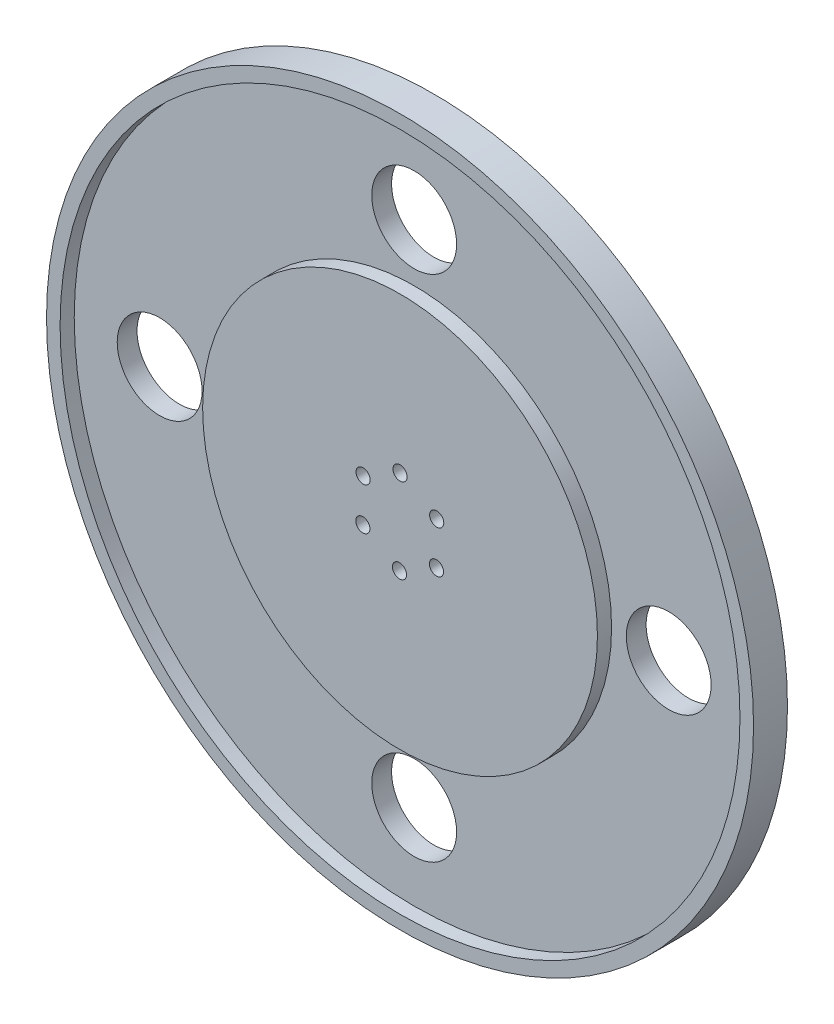
ISO-10303-21;
HEADER;
FILE_DESCRIPTION(('STEP AP214'),'2;1');
FILE_NAME('part.step','',(''),(''),'','','');
FILE_SCHEMA(('AUTOMOTIVE_DESIGN { 1 0 10303 214 1 1 1 1 }'));
ENDSEC;
DATA;
#1=APPLICATION_CONTEXT('core data for automotive mechanical design processes');
#2=APPLICATION_PROTOCOL_DEFINITION('international standard','automotive_design',2000,#1);
#3=PRODUCT_CONTEXT('',#1,'mechanical');
#4=PRODUCT('Part','Part','',(#3));
#5=PRODUCT_RELATED_PRODUCT_CATEGORY('part','',(#4));
#6=PRODUCT_DEFINITION_FORMATION('','',#4);
#7=PRODUCT_DEFINITION_CONTEXT('part definition',#1,'design');
#8=PRODUCT_DEFINITION('design','',#6,#7);
#9=PRODUCT_DEFINITION_SHAPE('','',#8);
#10=(LENGTH_UNIT() NAMED_UNIT(*) SI_UNIT(.MILLI.,.METRE.));
#11=(NAMED_UNIT(*) PLANE_ANGLE_UNIT() SI_UNIT($,.RADIAN.));
#12=(NAMED_UNIT(*) SI_UNIT($,.STERADIAN.) SOLID_ANGLE_UNIT());
#13=UNCERTAINTY_MEASURE_WITH_UNIT(LENGTH_MEASURE(1.E-05),#10,'distance_accuracy_value','');
#14=(GEOMETRIC_REPRESENTATION_CONTEXT(3) GLOBAL_UNCERTAINTY_ASSIGNED_CONTEXT((#13)) GLOBAL_UNIT_ASSIGNED_CONTEXT((#10,
#11,#12)) REPRESENTATION_CONTEXT('',''));
#15=CARTESIAN_POINT('',(0.,0.,0.));
#16=DIRECTION('',(0.,0.,1.));
#17=DIRECTION('',(1.,0.,0.));
#18=AXIS2_PLACEMENT_3D('',#15,#16,#17);
#19=CARTESIAN_POINT('',(0.,0.,7.62));
#20=DIRECTION('',(0.,0.,-1.));
#21=DIRECTION('',(-1.,0.,0.));
#22=AXIS2_PLACEMENT_3D('',#19,#20,#21);
#23=CYLINDRICAL_SURFACE('',#22,44.323);
#24=CARTESIAN_POINT('',(0.,0.,4.445));
#25=DIRECTION('',(0.,0.,1.));
#26=DIRECTION('',(1.,0.,0.));
#27=AXIS2_PLACEMENT_3D('',#24,#25,#26);
#28=CIRCLE('',#27,44.323);
#29=CARTESIAN_POINT('',(-44.323,0.,4.445));
#30=VERTEX_POINT('',#29);
#31=EDGE_CURVE('E47',#30,#30,#28,.T.);
#32=CARTESIAN_POINT('',(0.,0.,7.62));
#33=DIRECTION('',(0.,0.,1.));
#34=DIRECTION('',(1.,0.,0.));
#35=AXIS2_PLACEMENT_3D('',#32,#33,#34);
#36=CIRCLE('',#35,44.323);
#37=CARTESIAN_POINT('',(-44.323,0.,7.62));
#38=VERTEX_POINT('',#37);
#39=EDGE_CURVE('E11',#38,#38,#36,.T.);
#40=CARTESIAN_POINT('',(-44.323,0.,4.445));
#41=CARTESIAN_POINT('',(-44.323,0.,4.47807291666667));
#42=CARTESIAN_POINT('',(-44.323,0.,4.51114583333333));
#43=CARTESIAN_POINT('',(-44.323,0.,4.57729166666667));
#44=CARTESIAN_POINT('',(-44.323,0.,4.61036458333333));
#45=CARTESIAN_POINT('',(-44.323,0.,4.67651041666667));
#46=CARTESIAN_POINT('',(-44.323,0.,4.70958333333333));
#47=CARTESIAN_POINT('',(-44.323,0.,4.77572916666667));
#48=CARTESIAN_POINT('',(-44.323,0.,4.80880208333333));
#49=CARTESIAN_POINT('',(-44.323,0.,4.87494791666667));
#50=CARTESIAN_POINT('',(-44.323,0.,4.90802083333333));
#51=CARTESIAN_POINT('',(-44.323,0.,4.97416666666667));
#52=CARTESIAN_POINT('',(-44.323,0.,5.00723958333333));
#53=CARTESIAN_POINT('',(-44.323,0.,5.07338541666667));
#54=CARTESIAN_POINT('',(-44.323,0.,5.10645833333333));
#55=CARTESIAN_POINT('',(-44.323,0.,5.17260416666667));
#56=CARTESIAN_POINT('',(-44.323,0.,5.20567708333333));
#57=CARTESIAN_POINT('',(-44.323,0.,5.27182291666667));
#58=CARTESIAN_POINT('',(-44.323,0.,5.30489583333333));
#59=CARTESIAN_POINT('',(-44.323,0.,5.37104166666667));
#60=CARTESIAN_POINT('',(-44.323,0.,5.40411458333333));
#61=CARTESIAN_POINT('',(-44.323,0.,5.47026041666667));
#62=CARTESIAN_POINT('',(-44.323,0.,5.50333333333333));
#63=CARTESIAN_POINT('',(-44.323,0.,5.56947916666667));
#64=CARTESIAN_POINT('',(-44.323,0.,5.60255208333333));
#65=CARTESIAN_POINT('',(-44.323,0.,5.66869791666667));
#66=CARTESIAN_POINT('',(-44.323,0.,5.70177083333333));
#67=CARTESIAN_POINT('',(-44.323,0.,5.76791666666667));
#68=CARTESIAN_POINT('',(-44.323,0.,5.80098958333333));
#69=CARTESIAN_POINT('',(-44.323,0.,5.86713541666667));
#70=CARTESIAN_POINT('',(-44.323,0.,5.90020833333333));
#71=CARTESIAN_POINT('',(-44.323,0.,5.96635416666667));
#72=CARTESIAN_POINT('',(-44.323,0.,5.99942708333333));
#73=CARTESIAN_POINT('',(-44.323,0.,6.06557291666667));
#74=CARTESIAN_POINT('',(-44.323,0.,6.09864583333333));
#75=CARTESIAN_POINT('',(-44.323,0.,6.16479166666667));
#76=CARTESIAN_POINT('',(-44.323,0.,6.19786458333333));
#77=CARTESIAN_POINT('',(-44.323,0.,6.26401041666667));
#78=CARTESIAN_POINT('',(-44.323,0.,6.29708333333333));
#79=CARTESIAN_POINT('',(-44.323,0.,6.36322916666667));
#80=CARTESIAN_POINT('',(-44.323,0.,6.39630208333333));
#81=CARTESIAN_POINT('',(-44.323,0.,6.46244791666667));
#82=CARTESIAN_POINT('',(-44.323,0.,6.49552083333333));
#83=CARTESIAN_POINT('',(-44.323,0.,6.56166666666667));
#84=CARTESIAN_POINT('',(-44.323,0.,6.59473958333333));
#85=CARTESIAN_POINT('',(-44.323,0.,6.66088541666667));
#86=CARTESIAN_POINT('',(-44.323,0.,6.69395833333333));
#87=CARTESIAN_POINT('',(-44.323,0.,6.76010416666667));
#88=CARTESIAN_POINT('',(-44.323,0.,6.79317708333333));
#89=CARTESIAN_POINT('',(-44.323,0.,6.85932291666667));
#90=CARTESIAN_POINT('',(-44.323,0.,6.89239583333333));
#91=CARTESIAN_POINT('',(-44.323,0.,6.95854166666667));
#92=CARTESIAN_POINT('',(-44.323,0.,6.99161458333333));
#93=CARTESIAN_POINT('',(-44.323,0.,7.05776041666667));
#94=CARTESIAN_POINT('',(-44.323,0.,7.09083333333333));
#95=CARTESIAN_POINT('',(-44.323,0.,7.15697916666667));
#96=CARTESIAN_POINT('',(-44.323,0.,7.19005208333333));
#97=CARTESIAN_POINT('',(-44.323,0.,7.25619791666667));
#98=CARTESIAN_POINT('',(-44.323,0.,7.28927083333333));
#99=CARTESIAN_POINT('',(-44.323,0.,7.35541666666667));
#100=CARTESIAN_POINT('',(-44.323,0.,7.38848958333333));
#101=CARTESIAN_POINT('',(-44.323,0.,7.45463541666667));
#102=CARTESIAN_POINT('',(-44.323,0.,7.48770833333333));
#103=CARTESIAN_POINT('',(-44.323,0.,7.55385416666667));
#104=CARTESIAN_POINT('',(-44.323,0.,7.58692708333333));
#105=CARTESIAN_POINT('',(-44.323,0.,7.62));
#106=B_SPLINE_CURVE_WITH_KNOTS('',3,(#40,#41,#42,#43,#44,#45,#46,#47,#48,#49,#50,#51,#52,#53,
#54,#55,#56,#57,#58,#59,#60,#61,#62,#63,#64,#65,#66,#67,#68,#69,#70,#71,#72,#73,#74,#75,#76,#77,
#78,#79,#80,#81,#82,#83,#84,#85,#86,#87,#88,#89,#90,#91,#92,#93,#94,#95,#96,#97,#98,#99,#100,
#101,#102,#103,#104,#105),.UNSPECIFIED.,.F.,.F.,(4,2,2,2,2,2,2,2,2,2,2,2,2,2,2,2,2,2,2,2,2,2,2,
2,2,2,2,2,2,2,2,2,4),(0.,0.0992187499999995,0.198437499999999,0.29765625,0.396875,
0.496093749999999,0.595312499999999,0.69453125,0.793749999999999,0.89296875,0.9921875,
1.09140625,1.190625,1.28984375,1.3890625,1.48828125,1.5875,1.68671875,1.7859375,1.88515625,
1.984375,2.08359375,2.1828125,2.28203125,2.38125,2.48046875,2.5796875,2.67890625,2.778125,
2.87734375,2.9765625,3.07578125,3.175),.UNSPECIFIED.);
#107=EDGE_CURVE('BSEAM41',#30,#38,#106,.T.);
#108=ORIENTED_EDGE('',*,*,#31,.T.);
#109=ORIENTED_EDGE('',*,*,#39,.F.);
#110=ORIENTED_EDGE('',*,*,#107,.T.);
#111=ORIENTED_EDGE('',*,*,#107,.F.);
#112=EDGE_LOOP('',(#108,#110,#109,#111));
#113=FACE_BOUND('',#112,.T.);
#114=ADVANCED_FACE('F41',(#113),#23,.T.);
#115=CARTESIAN_POINT('',(0.,0.,7.62));
#116=DIRECTION('',(0.,0.,1.));
#117=DIRECTION('',(1.,0.,0.));
#118=AXIS2_PLACEMENT_3D('',#115,#116,#117);
#119=PLANE('',#118);
#120=CARTESIAN_POINT('',(0.,9.4996,7.62));
#121=DIRECTION('',(0.,0.,1.));
#122=DIRECTION('',(1.,0.,0.));
#123=AXIS2_PLACEMENT_3D('',#120,#121,#122);
#124=CIRCLE('',#123,1.5875);
#125=CARTESIAN_POINT('',(1.5875,9.4996,7.62));
#126=VERTEX_POINT('',#125);
#127=EDGE_CURVE('E116',#126,#126,#124,.F.);
#128=ORIENTED_EDGE('',*,*,#127,.T.);
#129=EDGE_LOOP('',(#128));
#130=FACE_BOUND('',#129,.T.);
#131=CARTESIAN_POINT('',(8.23253142357247,4.6766934802765,7.62));
#132=DIRECTION('',(0.,0.,1.));
#133=DIRECTION('',(1.,0.,0.));
#134=AXIS2_PLACEMENT_3D('',#131,#132,#133);
#135=CIRCLE('',#134,1.5875);
#136=CARTESIAN_POINT('',(9.82003142357247,4.6766934802765,7.62));
#137=VERTEX_POINT('',#136);
#138=EDGE_CURVE('E117',#137,#137,#135,.F.);
#139=ORIENTED_EDGE('',*,*,#138,.T.);
#140=EDGE_LOOP('',(#139));
#141=FACE_BOUND('',#140,.T.);
#142=CARTESIAN_POINT('',(8.17203756920048,-4.86434112985266,7.62));
#143=DIRECTION('',(0.,0.,1.));
#144=DIRECTION('',(1.,0.,0.));
#145=AXIS2_PLACEMENT_3D('',#142,#143,#144);
#146=CIRCLE('',#145,1.5875);
#147=CARTESIAN_POINT('',(9.75953756920048,-4.86434112985266,7.62));
#148=VERTEX_POINT('',#147);
#149=EDGE_CURVE('E91',#148,#148,#146,.F.);
#150=ORIENTED_EDGE('',*,*,#149,.T.);
#151=EDGE_LOOP('',(#150));
#152=FACE_BOUND('',#151,.T.);
#153=CARTESIAN_POINT('',(-0.120987708743892,-9.5824692202583,7.62));
#154=DIRECTION('',(0.,0.,1.));
#155=DIRECTION('',(1.,0.,0.));
#156=AXIS2_PLACEMENT_3D('',#153,#154,#155);
#157=CIRCLE('',#156,1.5875);
#158=CARTESIAN_POINT('',(1.46651229125611,-9.5824692202583,7.62));
#159=VERTEX_POINT('',#158);
#160=EDGE_CURVE('E98',#159,#159,#157,.F.);
#161=ORIENTED_EDGE('',*,*,#160,.T.);
#162=EDGE_LOOP('',(#161));
#163=FACE_BOUND('',#162,.T.);
#164=CARTESIAN_POINT('',(-8.3535191323163,-4.75956270053477,7.62));
#165=DIRECTION('',(0.,0.,1.));
#166=DIRECTION('',(1.,0.,0.));
#167=AXIS2_PLACEMENT_3D('',#164,#165,#166);
#168=CIRCLE('',#167,1.5875);
#169=CARTESIAN_POINT('',(-6.76601913231631,-4.75956270053477,7.62));
#170=VERTEX_POINT('',#169);
#171=EDGE_CURVE('E104',#170,#170,#168,.F.);
#172=ORIENTED_EDGE('',*,*,#171,.T.);
#173=EDGE_LOOP('',(#172));
#174=FACE_BOUND('',#173,.T.);
#175=CARTESIAN_POINT('',(-8.29302527794436,4.78147190959437,7.62));
#176=DIRECTION('',(0.,0.,1.));
#177=DIRECTION('',(1.,0.,0.));
#178=AXIS2_PLACEMENT_3D('',#175,#176,#177);
#179=CIRCLE('',#178,1.5875);
#180=CARTESIAN_POINT('',(-6.70552527794437,4.78147190959437,7.62));
#181=VERTEX_POINT('',#180);
#182=EDGE_CURVE('E110',#181,#181,#179,.F.);
#183=ORIENTED_EDGE('',*,*,#182,.T.);
#184=EDGE_LOOP('',(#183));
#185=FACE_BOUND('',#184,.T.);
#186=ORIENTED_EDGE('',*,*,#39,.T.);
#187=EDGE_LOOP('',(#186));
#188=FACE_BOUND('',#187,.T.);
#189=ADVANCED_FACE('F170',(#130,#141,#152,#163,#174,#185,#188),#119,.T.);
#190=CARTESIAN_POINT('',(0.,0.,4.445));
#191=DIRECTION('',(0.,0.,1.));
#192=DIRECTION('',(1.,0.,0.));
#193=AXIS2_PLACEMENT_3D('',#190,#191,#192);
#194=PLANE('',#193);
#195=CARTESIAN_POINT('',(0.,57.15,4.445));
#196=DIRECTION('',(0.,0.,1.));
#197=DIRECTION('',(1.,0.,0.));
#198=AXIS2_PLACEMENT_3D('',#195,#196,#197);
#199=CIRCLE('',#198,9.525);
#200=CARTESIAN_POINT('',(9.525,57.15,4.445));
#201=VERTEX_POINT('',#200);
#202=EDGE_CURVE('E86',#201,#201,#199,.F.);
#203=ORIENTED_EDGE('',*,*,#202,.T.);
#204=EDGE_LOOP('',(#203));
#205=FACE_BOUND('',#204,.T.);
#206=CARTESIAN_POINT('',(57.1499999999984,-1.62430069394759E-12,4.445));
#207=DIRECTION('',(0.,0.,1.));
#208=DIRECTION('',(1.,0.,0.));
#209=AXIS2_PLACEMENT_3D('',#206,#207,#208);
#210=CIRCLE('',#209,9.525);
#211=CARTESIAN_POINT('',(66.6749999999984,-1.62430069394759E-12,4.445));
#212=VERTEX_POINT('',#211);
#213=EDGE_CURVE('E80',#212,#212,#210,.F.);
#214=ORIENTED_EDGE('',*,*,#213,.T.);
#215=EDGE_LOOP('',(#214));
#216=FACE_BOUND('',#215,.T.);
#217=CARTESIAN_POINT('',(-3.23460367498092E-12,-57.15,4.445));
#218=DIRECTION('',(0.,0.,1.));
#219=DIRECTION('',(1.,0.,0.));
#220=AXIS2_PLACEMENT_3D('',#217,#218,#219);
#221=CIRCLE('',#220,9.525);
#222=CARTESIAN_POINT('',(9.52499999999676,-57.15,4.445));
#223=VERTEX_POINT('',#222);
#224=EDGE_CURVE('E74',#223,#223,#221,.F.);
#225=ORIENTED_EDGE('',*,*,#224,.T.);
#226=EDGE_LOOP('',(#225));
#227=FACE_BOUND('',#226,.T.);
#228=CARTESIAN_POINT('',(-57.1500000000016,1.61730183749046E-12,4.445));
#229=DIRECTION('',(0.,0.,1.));
#230=DIRECTION('',(1.,0.,0.));
#231=AXIS2_PLACEMENT_3D('',#228,#229,#230);
#232=CIRCLE('',#231,9.525);
#233=CARTESIAN_POINT('',(-47.6250000000016,1.61730183749046E-12,4.445));
#234=VERTEX_POINT('',#233);
#235=EDGE_CURVE('E67',#234,#234,#232,.F.);
#236=ORIENTED_EDGE('',*,*,#235,.T.);
#237=EDGE_LOOP('',(#236));
#238=FACE_BOUND('',#237,.T.);
#239=ORIENTED_EDGE('',*,*,#31,.F.);
#240=EDGE_LOOP('',(#239));
#241=FACE_BOUND('',#240,.T.);
#242=CARTESIAN_POINT('',(0.,0.,4.445));
#243=DIRECTION('',(0.,0.,1.));
#244=DIRECTION('',(1.,0.,0.));
#245=AXIS2_PLACEMENT_3D('',#242,#243,#244);
#246=CIRCLE('',#245,76.327);
#247=CARTESIAN_POINT('',(-76.327,0.,4.445));
#248=VERTEX_POINT('',#247);
#249=EDGE_CURVE('E51',#248,#248,#246,.F.);
#250=ORIENTED_EDGE('',*,*,#249,.F.);
#251=EDGE_LOOP('',(#250));
#252=FACE_BOUND('',#251,.T.);
#253=ADVANCED_FACE('F165',(#205,#216,#227,#238,#241,#252),#194,.T.);
#254=CARTESIAN_POINT('',(0.,0.,7.62));
#255=DIRECTION('',(0.,0.,-1.));
#256=DIRECTION('',(-1.,0.,0.));
#257=AXIS2_PLACEMENT_3D('',#254,#255,#256);
#258=CYLINDRICAL_SURFACE('',#257,76.327);
#259=CARTESIAN_POINT('',(0.,0.,7.62));
#260=DIRECTION('',(0.,0.,1.));
#261=DIRECTION('',(1.,0.,0.));
#262=AXIS2_PLACEMENT_3D('',#259,#260,#261);
#263=CIRCLE('',#262,76.327);
#264=CARTESIAN_POINT('',(-76.327,0.,7.62));
#265=VERTEX_POINT('',#264);
#266=EDGE_CURVE('E61',#265,#265,#263,.T.);
#267=CARTESIAN_POINT('',(-76.327,0.,4.445));
#268=CARTESIAN_POINT('',(-76.327,0.,4.47807291666667));
#269=CARTESIAN_POINT('',(-76.327,0.,4.51114583333333));
#270=CARTESIAN_POINT('',(-76.327,0.,4.57729166666667));
#271=CARTESIAN_POINT('',(-76.327,0.,4.61036458333333));
#272=CARTESIAN_POINT('',(-76.327,0.,4.67651041666667));
#273=CARTESIAN_POINT('',(-76.327,0.,4.70958333333333));
#274=CARTESIAN_POINT('',(-76.327,0.,4.77572916666667));
#275=CARTESIAN_POINT('',(-76.327,0.,4.80880208333333));
#276=CARTESIAN_POINT('',(-76.327,0.,4.87494791666667));
#277=CARTESIAN_POINT('',(-76.327,0.,4.90802083333333));
#278=CARTESIAN_POINT('',(-76.327,0.,4.97416666666667));
#279=CARTESIAN_POINT('',(-76.327,0.,5.00723958333333));
#280=CARTESIAN_POINT('',(-76.327,0.,5.07338541666667));
#281=CARTESIAN_POINT('',(-76.327,0.,5.10645833333333));
#282=CARTESIAN_POINT('',(-76.327,0.,5.17260416666667));
#283=CARTESIAN_POINT('',(-76.327,0.,5.20567708333333));
#284=CARTESIAN_POINT('',(-76.327,0.,5.27182291666667));
#285=CARTESIAN_POINT('',(-76.327,0.,5.30489583333333));
#286=CARTESIAN_POINT('',(-76.327,0.,5.37104166666667));
#287=CARTESIAN_POINT('',(-76.327,0.,5.40411458333333));
#288=CARTESIAN_POINT('',(-76.327,0.,5.47026041666667));
#289=CARTESIAN_POINT('',(-76.327,0.,5.50333333333333));
#290=CARTESIAN_POINT('',(-76.327,0.,5.56947916666667));
#291=CARTESIAN_POINT('',(-76.327,0.,5.60255208333333));
#292=CARTESIAN_POINT('',(-76.327,0.,5.66869791666667));
#293=CARTESIAN_POINT('',(-76.327,0.,5.70177083333333));
#294=CARTESIAN_POINT('',(-76.327,0.,5.76791666666667));
#295=CARTESIAN_POINT('',(-76.327,0.,5.80098958333333));
#296=CARTESIAN_POINT('',(-76.327,0.,5.86713541666667));
#297=CARTESIAN_POINT('',(-76.327,0.,5.90020833333333));
#298=CARTESIAN_POINT('',(-76.327,0.,5.96635416666667));
#299=CARTESIAN_POINT('',(-76.327,0.,5.99942708333333));
#300=CARTESIAN_POINT('',(-76.327,0.,6.06557291666667));
#301=CARTESIAN_POINT('',(-76.327,0.,6.09864583333333));
#302=CARTESIAN_POINT('',(-76.327,0.,6.16479166666667));
#303=CARTESIAN_POINT('',(-76.327,0.,6.19786458333333));
#304=CARTESIAN_POINT('',(-76.327,0.,6.26401041666667));
#305=CARTESIAN_POINT('',(-76.327,0.,6.29708333333333));
#306=CARTESIAN_POINT('',(-76.327,0.,6.36322916666667));
#307=CARTESIAN_POINT('',(-76.327,0.,6.39630208333333));
#308=CARTESIAN_POINT('',(-76.327,0.,6.46244791666667));
#309=CARTESIAN_POINT('',(-76.327,0.,6.49552083333333));
#310=CARTESIAN_POINT('',(-76.327,0.,6.56166666666667));
#311=CARTESIAN_POINT('',(-76.327,0.,6.59473958333333));
#312=CARTESIAN_POINT('',(-76.327,0.,6.66088541666667));
#313=CARTESIAN_POINT('',(-76.327,0.,6.69395833333333));
#314=CARTESIAN_POINT('',(-76.327,0.,6.76010416666667));
#315=CARTESIAN_POINT('',(-76.327,0.,6.79317708333333));
#316=CARTESIAN_POINT('',(-76.327,0.,6.85932291666667));
#317=CARTESIAN_POINT('',(-76.327,0.,6.89239583333333));
#318=CARTESIAN_POINT('',(-76.327,0.,6.95854166666667));
#319=CARTESIAN_POINT('',(-76.327,0.,6.99161458333333));
#320=CARTESIAN_POINT('',(-76.327,0.,7.05776041666667));
#321=CARTESIAN_POINT('',(-76.327,0.,7.09083333333333));
#322=CARTESIAN_POINT('',(-76.327,0.,7.15697916666667));
#323=CARTESIAN_POINT('',(-76.327,0.,7.19005208333333));
#324=CARTESIAN_POINT('',(-76.327,0.,7.25619791666667));
#325=CARTESIAN_POINT('',(-76.327,0.,7.28927083333333));
#326=CARTESIAN_POINT('',(-76.327,0.,7.35541666666667));
#327=CARTESIAN_POINT('',(-76.327,0.,7.38848958333333));
#328=CARTESIAN_POINT('',(-76.327,0.,7.45463541666667));
#329=CARTESIAN_POINT('',(-76.327,0.,7.48770833333333));
#330=CARTESIAN_POINT('',(-76.327,0.,7.55385416666667));
#331=CARTESIAN_POINT('',(-76.327,0.,7.58692708333333));
#332=CARTESIAN_POINT('',(-76.327,0.,7.62));
#333=B_SPLINE_CURVE_WITH_KNOTS('',3,(#267,#268,#269,#270,#271,#272,#273,#274,#275,#276,#277,
#278,#279,#280,#281,#282,#283,#284,#285,#286,#287,#288,#289,#290,#291,#292,#293,#294,#295,#296,
#297,#298,#299,#300,#301,#302,#303,#304,#305,#306,#307,#308,#309,#310,#311,#312,#313,#314,#315,
#316,#317,#318,#319,#320,#321,#322,#323,#324,#325,#326,#327,#328,#329,#330,#331,#332),
.UNSPECIFIED.,.F.,.F.,(4,2,2,2,2,2,2,2,2,2,2,2,2,2,2,2,2,2,2,2,2,2,2,2,2,2,2,2,2,2,2,2,4),(0.,
0.0992187499999995,0.198437499999999,0.29765625,0.396875,0.496093749999999,0.595312499999999,
0.69453125,0.793749999999999,0.89296875,0.9921875,1.09140625,1.190625,1.28984375,1.3890625,
1.48828125,1.5875,1.68671875,1.7859375,1.88515625,1.984375,2.08359375,2.1828125,2.28203125,
2.38125,2.48046875,2.5796875,2.67890625,2.778125,2.87734375,2.9765625,3.07578125,3.175),.UNSPECIFIED.);
#334=EDGE_CURVE('BSEAM156',#248,#265,#333,.T.);
#335=ORIENTED_EDGE('',*,*,#249,.T.);
#336=ORIENTED_EDGE('',*,*,#266,.T.);
#337=ORIENTED_EDGE('',*,*,#334,.T.);
#338=ORIENTED_EDGE('',*,*,#334,.F.);
#339=EDGE_LOOP('',(#335,#337,#336,#338));
#340=FACE_BOUND('',#339,.T.);
#341=ADVANCED_FACE('F156',(#340),#258,.F.);
#342=CARTESIAN_POINT('',(0.,0.,7.62));
#343=DIRECTION('',(0.,0.,-1.));
#344=DIRECTION('',(-1.,0.,0.));
#345=AXIS2_PLACEMENT_3D('',#342,#343,#344);
#346=CYLINDRICAL_SURFACE('',#345,79.375);
#347=CARTESIAN_POINT('',(0.,0.,7.62));
#348=DIRECTION('',(0.,0.,1.));
#349=DIRECTION('',(1.,0.,0.));
#350=AXIS2_PLACEMENT_3D('',#347,#348,#349);
#351=CIRCLE('',#350,79.375);
#352=CARTESIAN_POINT('',(-79.375,0.,7.62));
#353=VERTEX_POINT('',#352);
#354=EDGE_CURVE('E55',#353,#353,#351,.T.);
#355=CARTESIAN_POINT('',(0.,0.,0.));
#356=DIRECTION('',(0.,0.,1.));
#357=DIRECTION('',(1.,0.,0.));
#358=AXIS2_PLACEMENT_3D('',#355,#356,#357);
#359=CIRCLE('',#358,79.375);
#360=CARTESIAN_POINT('',(-79.375,0.,0.));
#361=VERTEX_POINT('',#360);
#362=EDGE_CURVE('E58',#361,#361,#359,.T.);
#363=CARTESIAN_POINT('',(-79.375,0.,7.62));
#364=CARTESIAN_POINT('',(-79.375,0.,7.540625));
#365=CARTESIAN_POINT('',(-79.375,0.,7.46125));
#366=CARTESIAN_POINT('',(-79.375,0.,7.3025));
#367=CARTESIAN_POINT('',(-79.375,0.,7.223125));
#368=CARTESIAN_POINT('',(-79.375,0.,7.064375));
#369=CARTESIAN_POINT('',(-79.375,0.,6.985));
#370=CARTESIAN_POINT('',(-79.375,0.,6.82625));
#371=CARTESIAN_POINT('',(-79.375,0.,6.746875));
#372=CARTESIAN_POINT('',(-79.375,0.,6.588125));
#373=CARTESIAN_POINT('',(-79.375,0.,6.50875));
#374=CARTESIAN_POINT('',(-79.375,0.,6.35));
#375=CARTESIAN_POINT('',(-79.375,0.,6.270625));
#376=CARTESIAN_POINT('',(-79.375,0.,6.111875));
#377=CARTESIAN_POINT('',(-79.375,0.,6.0325));
#378=CARTESIAN_POINT('',(-79.375,0.,5.87375));
#379=CARTESIAN_POINT('',(-79.375,0.,5.794375));
#380=CARTESIAN_POINT('',(-79.375,0.,5.635625));
#381=CARTESIAN_POINT('',(-79.375,0.,5.55625));
#382=CARTESIAN_POINT('',(-79.375,0.,5.3975));
#383=CARTESIAN_POINT('',(-79.375,0.,5.318125));
#384=CARTESIAN_POINT('',(-79.375,0.,5.159375));
#385=CARTESIAN_POINT('',(-79.375,0.,5.08));
#386=CARTESIAN_POINT('',(-79.375,0.,4.92125));
#387=CARTESIAN_POINT('',(-79.375,0.,4.841875));
#388=CARTESIAN_POINT('',(-79.375,0.,4.683125));
#389=CARTESIAN_POINT('',(-79.375,0.,4.60375));
#390=CARTESIAN_POINT('',(-79.375,0.,4.445));
#391=CARTESIAN_POINT('',(-79.375,0.,4.365625));
#392=CARTESIAN_POINT('',(-79.375,0.,4.206875));
#393=CARTESIAN_POINT('',(-79.375,0.,4.1275));
#394=CARTESIAN_POINT('',(-79.375,0.,3.96875));
#395=CARTESIAN_POINT('',(-79.375,0.,3.889375));
#396=CARTESIAN_POINT('',(-79.375,0.,3.730625));
#397=CARTESIAN_POINT('',(-79.375,0.,3.65125));
#398=CARTESIAN_POINT('',(-79.375,0.,3.4925));
#399=CARTESIAN_POINT('',(-79.375,0.,3.413125));
#400=CARTESIAN_POINT('',(-79.375,0.,3.254375));
#401=CARTESIAN_POINT('',(-79.375,0.,3.175));
#402=CARTESIAN_POINT('',(-79.375,0.,3.01625));
#403=CARTESIAN_POINT('',(-79.375,0.,2.936875));
#404=CARTESIAN_POINT('',(-79.375,0.,2.778125));
#405=CARTESIAN_POINT('',(-79.375,0.,2.69875));
#406=CARTESIAN_POINT('',(-79.375,0.,2.54));
#407=CARTESIAN_POINT('',(-79.375,0.,2.460625));
#408=CARTESIAN_POINT('',(-79.375,0.,2.301875));
#409=CARTESIAN_POINT('',(-79.375,0.,2.2225));
#410=CARTESIAN_POINT('',(-79.375,0.,2.06375));
#411=CARTESIAN_POINT('',(-79.375,0.,1.984375));
#412=CARTESIAN_POINT('',(-79.375,0.,1.825625));
#413=CARTESIAN_POINT('',(-79.375,0.,1.74625));
#414=CARTESIAN_POINT('',(-79.375,0.,1.5875));
#415=CARTESIAN_POINT('',(-79.375,0.,1.508125));
#416=CARTESIAN_POINT('',(-79.375,0.,1.349375));
#417=CARTESIAN_POINT('',(-79.375,0.,1.27));
#418=CARTESIAN_POINT('',(-79.375,0.,1.11125));
#419=CARTESIAN_POINT('',(-79.375,0.,1.031875));
#420=CARTESIAN_POINT('',(-79.375,0.,0.873125));
#421=CARTESIAN_POINT('',(-79.375,0.,0.79375));
#422=CARTESIAN_POINT('',(-79.375,0.,0.635));
#423=CARTESIAN_POINT('',(-79.375,0.,0.555625));
#424=CARTESIAN_POINT('',(-79.375,0.,0.396875));
#425=CARTESIAN_POINT('',(-79.375,0.,0.3175));
#426=CARTESIAN_POINT('',(-79.375,0.,0.15875));
#427=CARTESIAN_POINT('',(-79.375,0.,0.0793749999999999));
#428=CARTESIAN_POINT('',(-79.375,0.,0.));
#429=B_SPLINE_CURVE_WITH_KNOTS('',3,(#363,#364,#365,#366,#367,#368,#369,#370,#371,#372,#373,
#374,#375,#376,#377,#378,#379,#380,#381,#382,#383,#384,#385,#386,#387,#388,#389,#390,#391,#392,
#393,#394,#395,#396,#397,#398,#399,#400,#401,#402,#403,#404,#405,#406,#407,#408,#409,#410,#411,
#412,#413,#414,#415,#416,#417,#418,#419,#420,#421,#422,#423,#424,#425,#426,#427,#428),
.UNSPECIFIED.,.F.,.F.,(4,2,2,2,2,2,2,2,2,2,2,2,2,2,2,2,2,2,2,2,2,2,2,2,2,2,2,2,2,2,2,2,4),(0.,
0.238125,0.476249999999999,0.714375,0.952499999999999,1.190625,1.42875,1.666875,1.905,2.143125,
2.38125,2.619375,2.8575,3.095625,3.33375,3.571875,3.81,4.048125,4.28625,4.524375,4.7625,
5.000625,5.23875,5.476875,5.715,5.953125,6.19125,6.429375,6.6675,6.905625,7.14375,7.381875,
7.62),.UNSPECIFIED.);
#430=EDGE_CURVE('BSEAM154',#353,#361,#429,.T.);
#431=ORIENTED_EDGE('',*,*,#354,.F.);
#432=ORIENTED_EDGE('',*,*,#362,.T.);
#433=ORIENTED_EDGE('',*,*,#430,.T.);
#434=ORIENTED_EDGE('',*,*,#430,.F.);
#435=EDGE_LOOP('',(#431,#433,#432,#434));
#436=FACE_BOUND('',#435,.T.);
#437=ADVANCED_FACE('F154',(#436),#346,.T.);
#438=CARTESIAN_POINT('',(0.,0.,7.62));
#439=DIRECTION('',(0.,0.,1.));
#440=DIRECTION('',(1.,0.,0.));
#441=AXIS2_PLACEMENT_3D('',#438,#439,#440);
#442=PLANE('',#441);
#443=ORIENTED_EDGE('',*,*,#266,.F.);
#444=EDGE_LOOP('',(#443));
#445=FACE_BOUND('',#444,.T.);
#446=ORIENTED_EDGE('',*,*,#354,.T.);
#447=EDGE_LOOP('',(#446));
#448=FACE_BOUND('',#447,.T.);
#449=ADVANCED_FACE('F133',(#445,#448),#442,.T.);
#450=CARTESIAN_POINT('',(0.,0.,0.));
#451=DIRECTION('',(0.,0.,1.));
#452=DIRECTION('',(1.,0.,0.));
#453=AXIS2_PLACEMENT_3D('',#450,#451,#452);
#454=PLANE('',#453);
#455=CARTESIAN_POINT('',(0.,9.4996,0.));
#456=DIRECTION('',(0.,0.,-1.));
#457=DIRECTION('',(-1.,0.,0.));
#458=AXIS2_PLACEMENT_3D('',#455,#456,#457);
#459=CIRCLE('',#458,1.5875);
#460=CARTESIAN_POINT('',(-1.5875,9.4996,0.));
#461=VERTEX_POINT('',#460);
#462=EDGE_CURVE('E71',#461,#461,#459,.T.);
#463=ORIENTED_EDGE('',*,*,#462,.F.);
#464=EDGE_LOOP('',(#463));
#465=FACE_BOUND('',#464,.T.);
#466=CARTESIAN_POINT('',(8.23253142357247,4.6766934802765,0.));
#467=DIRECTION('',(0.,0.,-1.));
#468=DIRECTION('',(-1.,0.,0.));
#469=AXIS2_PLACEMENT_3D('',#466,#467,#468);
#470=CIRCLE('',#469,1.5875);
#471=CARTESIAN_POINT('',(6.64503142357247,4.6766934802765,0.));
#472=VERTEX_POINT('',#471);
#473=EDGE_CURVE('E95',#472,#472,#470,.T.);
#474=ORIENTED_EDGE('',*,*,#473,.F.);
#475=EDGE_LOOP('',(#474));
#476=FACE_BOUND('',#475,.T.);
#477=CARTESIAN_POINT('',(8.17203756920048,-4.86434112985266,0.));
#478=DIRECTION('',(0.,0.,-1.));
#479=DIRECTION('',(-1.,0.,0.));
#480=AXIS2_PLACEMENT_3D('',#477,#478,#479);
#481=CIRCLE('',#480,1.5875);
#482=CARTESIAN_POINT('',(6.58453756920048,-4.86434112985266,0.));
#483=VERTEX_POINT('',#482);
#484=EDGE_CURVE('E94',#483,#483,#481,.T.);
#485=ORIENTED_EDGE('',*,*,#484,.F.);
#486=EDGE_LOOP('',(#485));
#487=FACE_BOUND('',#486,.T.);
#488=CARTESIAN_POINT('',(-0.120987708743892,-9.5824692202583,0.));
#489=DIRECTION('',(0.,0.,-1.));
#490=DIRECTION('',(-1.,0.,0.));
#491=AXIS2_PLACEMENT_3D('',#488,#489,#490);
#492=CIRCLE('',#491,1.5875);
#493=CARTESIAN_POINT('',(-1.70848770874389,-9.5824692202583,0.));
#494=VERTEX_POINT('',#493);
#495=EDGE_CURVE('E101',#494,#494,#492,.T.);
#496=ORIENTED_EDGE('',*,*,#495,.F.);
#497=EDGE_LOOP('',(#496));
#498=FACE_BOUND('',#497,.T.);
#499=CARTESIAN_POINT('',(-8.3535191323163,-4.75956270053477,0.));
#500=DIRECTION('',(0.,0.,-1.));
#501=DIRECTION('',(-1.,0.,0.));
#502=AXIS2_PLACEMENT_3D('',#499,#500,#501);
#503=CIRCLE('',#502,1.5875);
#504=CARTESIAN_POINT('',(-9.9410191323163,-4.75956270053477,0.));
#505=VERTEX_POINT('',#504);
#506=EDGE_CURVE('E107',#505,#505,#503,.T.);
#507=ORIENTED_EDGE('',*,*,#506,.F.);
#508=EDGE_LOOP('',(#507));
#509=FACE_BOUND('',#508,.T.);
#510=CARTESIAN_POINT('',(-8.29302527794436,4.78147190959437,0.));
#511=DIRECTION('',(0.,0.,-1.));
#512=DIRECTION('',(-1.,0.,0.));
#513=AXIS2_PLACEMENT_3D('',#510,#511,#512);
#514=CIRCLE('',#513,1.5875);
#515=CARTESIAN_POINT('',(-9.88052527794436,4.78147190959437,0.));
#516=VERTEX_POINT('',#515);
#517=EDGE_CURVE('E113',#516,#516,#514,.T.);
#518=ORIENTED_EDGE('',*,*,#517,.F.);
#519=EDGE_LOOP('',(#518));
#520=FACE_BOUND('',#519,.T.);
#521=CARTESIAN_POINT('',(0.,57.15,0.));
#522=DIRECTION('',(0.,0.,-1.));
#523=DIRECTION('',(-1.,0.,0.));
#524=AXIS2_PLACEMENT_3D('',#521,#522,#523);
#525=CIRCLE('',#524,9.525);
#526=CARTESIAN_POINT('',(-9.525,57.15,0.));
#527=VERTEX_POINT('',#526);
#528=EDGE_CURVE('E62',#527,#527,#525,.T.);
#529=ORIENTED_EDGE('',*,*,#528,.F.);
#530=EDGE_LOOP('',(#529));
#531=FACE_BOUND('',#530,.T.);
#532=CARTESIAN_POINT('',(57.1499999999984,-1.62430069394759E-12,0.));
#533=DIRECTION('',(0.,0.,-1.));
#534=DIRECTION('',(-1.,0.,0.));
#535=AXIS2_PLACEMENT_3D('',#532,#533,#534);
#536=CIRCLE('',#535,9.525);
#537=CARTESIAN_POINT('',(47.6249999999984,-1.62430069394759E-12,0.));
#538=VERTEX_POINT('',#537);
#539=EDGE_CURVE('E83',#538,#538,#536,.T.);
#540=ORIENTED_EDGE('',*,*,#539,.F.);
#541=EDGE_LOOP('',(#540));
#542=FACE_BOUND('',#541,.T.);
#543=CARTESIAN_POINT('',(-3.23460367498092E-12,-57.15,0.));
#544=DIRECTION('',(0.,0.,-1.));
#545=DIRECTION('',(-1.,0.,0.));
#546=AXIS2_PLACEMENT_3D('',#543,#544,#545);
#547=CIRCLE('',#546,9.525);
#548=CARTESIAN_POINT('',(-9.52500000000323,-57.15,0.));
#549=VERTEX_POINT('',#548);
#550=EDGE_CURVE('E77',#549,#549,#547,.T.);
#551=ORIENTED_EDGE('',*,*,#550,.F.);
#552=EDGE_LOOP('',(#551));
#553=FACE_BOUND('',#552,.T.);
#554=CARTESIAN_POINT('',(-57.1500000000016,1.61730183749046E-12,0.));
#555=DIRECTION('',(0.,0.,-1.));
#556=DIRECTION('',(-1.,0.,0.));
#557=AXIS2_PLACEMENT_3D('',#554,#555,#556);
#558=CIRCLE('',#557,9.525);
#559=CARTESIAN_POINT('',(-66.6750000000016,1.61730183749046E-12,0.));
#560=VERTEX_POINT('',#559);
#561=EDGE_CURVE('E70',#560,#560,#558,.T.);
#562=ORIENTED_EDGE('',*,*,#561,.F.);
#563=EDGE_LOOP('',(#562));
#564=FACE_BOUND('',#563,.T.);
#565=ORIENTED_EDGE('',*,*,#362,.F.);
#566=EDGE_LOOP('',(#565));
#567=FACE_BOUND('',#566,.T.);
#568=ADVANCED_FACE('F129',(#465,#476,#487,#498,#509,#520,#531,#542,#553,#564,#567),#454,.F.);
#569=CARTESIAN_POINT('',(-57.1500000000016,1.61730183749046E-12,7.621));
#570=DIRECTION('',(0.,0.,-1.));
#571=DIRECTION('',(-1.,0.,0.));
#572=AXIS2_PLACEMENT_3D('',#569,#570,#571);
#573=CYLINDRICAL_SURFACE('',#572,9.525);
#574=ORIENTED_EDGE('',*,*,#235,.F.);
#575=EDGE_LOOP('',(#574));
#576=FACE_BOUND('',#575,.T.);
#577=ORIENTED_EDGE('',*,*,#561,.T.);
#578=EDGE_LOOP('',(#577));
#579=FACE_BOUND('',#578,.T.);
#580=ADVANCED_FACE('F132',(#576,#579),#573,.F.);
#581=CARTESIAN_POINT('',(-3.23460367498092E-12,-57.15,7.621));
#582=DIRECTION('',(0.,0.,-1.));
#583=DIRECTION('',(-1.,0.,0.));
#584=AXIS2_PLACEMENT_3D('',#581,#582,#583);
#585=CYLINDRICAL_SURFACE('',#584,9.525);
#586=ORIENTED_EDGE('',*,*,#224,.F.);
#587=EDGE_LOOP('',(#586));
#588=FACE_BOUND('',#587,.T.);
#589=ORIENTED_EDGE('',*,*,#550,.T.);
#590=EDGE_LOOP('',(#589));
#591=FACE_BOUND('',#590,.T.);
#592=ADVANCED_FACE('F223',(#588,#591),#585,.F.);
#593=CARTESIAN_POINT('',(57.1499999999984,-1.62430069394759E-12,7.621));
#594=DIRECTION('',(0.,0.,-1.));
#595=DIRECTION('',(-1.,0.,0.));
#596=AXIS2_PLACEMENT_3D('',#593,#594,#595);
#597=CYLINDRICAL_SURFACE('',#596,9.525);
#598=ORIENTED_EDGE('',*,*,#213,.F.);
#599=EDGE_LOOP('',(#598));
#600=FACE_BOUND('',#599,.T.);
#601=ORIENTED_EDGE('',*,*,#539,.T.);
#602=EDGE_LOOP('',(#601));
#603=FACE_BOUND('',#602,.T.);
#604=ADVANCED_FACE('F207',(#600,#603),#597,.F.);
#605=CARTESIAN_POINT('',(0.,57.15,7.621));
#606=DIRECTION('',(0.,0.,-1.));
#607=DIRECTION('',(-1.,0.,0.));
#608=AXIS2_PLACEMENT_3D('',#605,#606,#607);
#609=CYLINDRICAL_SURFACE('',#608,9.525);
#610=ORIENTED_EDGE('',*,*,#202,.F.);
#611=EDGE_LOOP('',(#610));
#612=FACE_BOUND('',#611,.T.);
#613=ORIENTED_EDGE('',*,*,#528,.T.);
#614=EDGE_LOOP('',(#613));
#615=FACE_BOUND('',#614,.T.);
#616=ADVANCED_FACE('F198',(#612,#615),#609,.F.);
#617=CARTESIAN_POINT('',(-8.29302527794436,4.78147190959437,7.621));
#618=DIRECTION('',(0.,0.,-1.));
#619=DIRECTION('',(-1.,0.,0.));
#620=AXIS2_PLACEMENT_3D('',#617,#618,#619);
#621=CYLINDRICAL_SURFACE('',#620,1.5875);
#622=ORIENTED_EDGE('',*,*,#182,.F.);
#623=EDGE_LOOP('',(#622));
#624=FACE_BOUND('',#623,.T.);
#625=ORIENTED_EDGE('',*,*,#517,.T.);
#626=EDGE_LOOP('',(#625));
#627=FACE_BOUND('',#626,.T.);
#628=ADVANCED_FACE('F194',(#624,#627),#621,.F.);
#629=CARTESIAN_POINT('',(-8.3535191323163,-4.75956270053477,7.621));
#630=DIRECTION('',(0.,0.,-1.));
#631=DIRECTION('',(-1.,0.,0.));
#632=AXIS2_PLACEMENT_3D('',#629,#630,#631);
#633=CYLINDRICAL_SURFACE('',#632,1.5875);
#634=ORIENTED_EDGE('',*,*,#171,.F.);
#635=EDGE_LOOP('',(#634));
#636=FACE_BOUND('',#635,.T.);
#637=ORIENTED_EDGE('',*,*,#506,.T.);
#638=EDGE_LOOP('',(#637));
#639=FACE_BOUND('',#638,.T.);
#640=ADVANCED_FACE('F197',(#636,#639),#633,.F.);
#641=CARTESIAN_POINT('',(-0.120987708743892,-9.5824692202583,7.621));
#642=DIRECTION('',(0.,0.,-1.));
#643=DIRECTION('',(-1.,0.,0.));
#644=AXIS2_PLACEMENT_3D('',#641,#642,#643);
#645=CYLINDRICAL_SURFACE('',#644,1.5875);
#646=ORIENTED_EDGE('',*,*,#160,.F.);
#647=EDGE_LOOP('',(#646));
#648=FACE_BOUND('',#647,.T.);
#649=ORIENTED_EDGE('',*,*,#495,.T.);
#650=EDGE_LOOP('',(#649));
#651=FACE_BOUND('',#650,.T.);
#652=ADVANCED_FACE('F204',(#648,#651),#645,.F.);
#653=CARTESIAN_POINT('',(8.17203756920048,-4.86434112985266,7.621));
#654=DIRECTION('',(0.,0.,-1.));
#655=DIRECTION('',(-1.,0.,0.));
#656=AXIS2_PLACEMENT_3D('',#653,#654,#655);
#657=CYLINDRICAL_SURFACE('',#656,1.5875);
#658=ORIENTED_EDGE('',*,*,#149,.F.);
#659=EDGE_LOOP('',(#658));
#660=FACE_BOUND('',#659,.T.);
#661=ORIENTED_EDGE('',*,*,#484,.T.);
#662=EDGE_LOOP('',(#661));
#663=FACE_BOUND('',#662,.T.);
#664=ADVANCED_FACE('F216',(#660,#663),#657,.F.);
#665=CARTESIAN_POINT('',(8.23253142357247,4.6766934802765,7.621));
#666=DIRECTION('',(0.,0.,-1.));
#667=DIRECTION('',(-1.,0.,0.));
#668=AXIS2_PLACEMENT_3D('',#665,#666,#667);
#669=CYLINDRICAL_SURFACE('',#668,1.5875);
#670=ORIENTED_EDGE('',*,*,#138,.F.);
#671=EDGE_LOOP('',(#670));
#672=FACE_BOUND('',#671,.T.);
#673=ORIENTED_EDGE('',*,*,#473,.T.);
#674=EDGE_LOOP('',(#673));
#675=FACE_BOUND('',#674,.T.);
#676=ADVANCED_FACE('F211',(#672,#675),#669,.F.);
#677=CARTESIAN_POINT('',(0.,9.4996,7.621));
#678=DIRECTION('',(0.,0.,-1.));
#679=DIRECTION('',(-1.,0.,0.));
#680=AXIS2_PLACEMENT_3D('',#677,#678,#679);
#681=CYLINDRICAL_SURFACE('',#680,1.5875);
#682=ORIENTED_EDGE('',*,*,#127,.F.);
#683=EDGE_LOOP('',(#682));
#684=FACE_BOUND('',#683,.T.);
#685=ORIENTED_EDGE('',*,*,#462,.T.);
#686=EDGE_LOOP('',(#685));
#687=FACE_BOUND('',#686,.T.);
#688=ADVANCED_FACE('F127',(#684,#687),#681,.F.);
#689=CLOSED_SHELL('',(#114,#189,#253,#341,#437,#449,#568,#580,#592,#604,#616,#628,#640,#652,
#664,#676,#688));
#690=MANIFOLD_SOLID_BREP('B2',#689);
#691=ADVANCED_BREP_SHAPE_REPRESENTATION('',(#18,#690),#14);
#692=SHAPE_DEFINITION_REPRESENTATION(#9,#691);
ENDSEC;
END-ISO-10303-21;
